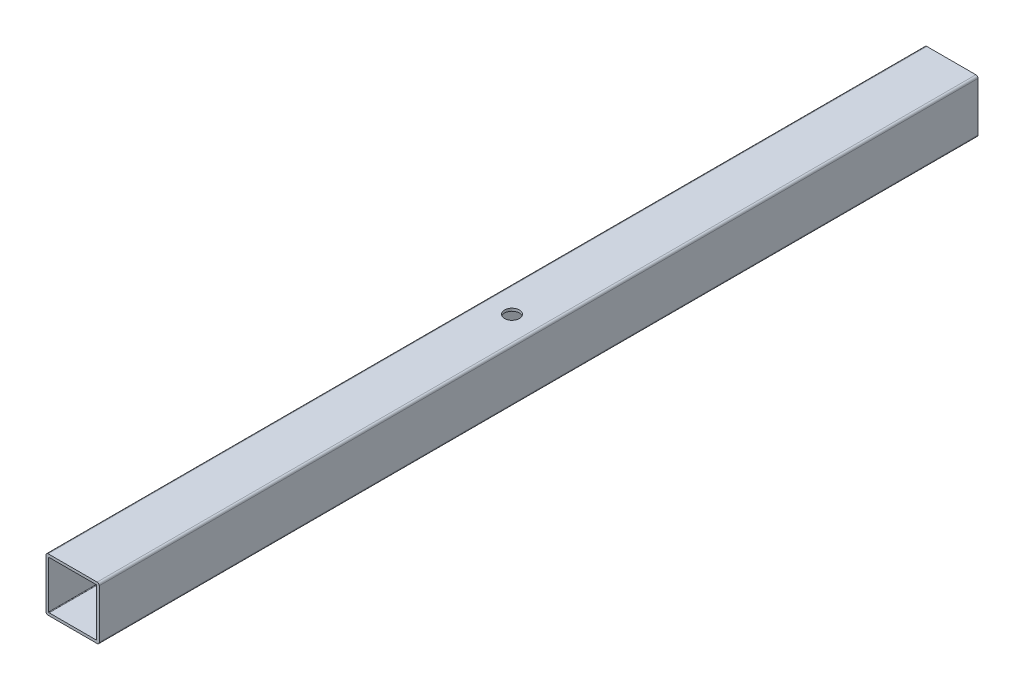
ISO-10303-21;
HEADER;
FILE_DESCRIPTION(('STEP AP214'),'2;1');
FILE_NAME('part.step','',(''),(''),'','','');
FILE_SCHEMA(('AUTOMOTIVE_DESIGN { 1 0 10303 214 1 1 1 1 }'));
ENDSEC;
DATA;
#1=APPLICATION_CONTEXT('core data for automotive mechanical design processes');
#2=APPLICATION_PROTOCOL_DEFINITION('international standard','automotive_design',2000,#1);
#3=PRODUCT_CONTEXT('',#1,'mechanical');
#4=PRODUCT('Part','Part','',(#3));
#5=PRODUCT_RELATED_PRODUCT_CATEGORY('part','',(#4));
#6=PRODUCT_DEFINITION_FORMATION('','',#4);
#7=PRODUCT_DEFINITION_CONTEXT('part definition',#1,'design');
#8=PRODUCT_DEFINITION('design','',#6,#7);
#9=PRODUCT_DEFINITION_SHAPE('','',#8);
#10=(LENGTH_UNIT() NAMED_UNIT(*) SI_UNIT(.MILLI.,.METRE.));
#11=(NAMED_UNIT(*) PLANE_ANGLE_UNIT() SI_UNIT($,.RADIAN.));
#12=(NAMED_UNIT(*) SI_UNIT($,.STERADIAN.) SOLID_ANGLE_UNIT());
#13=UNCERTAINTY_MEASURE_WITH_UNIT(LENGTH_MEASURE(1.E-05),#10,'distance_accuracy_value','');
#14=(GEOMETRIC_REPRESENTATION_CONTEXT(3) GLOBAL_UNCERTAINTY_ASSIGNED_CONTEXT((#13)) GLOBAL_UNIT_ASSIGNED_CONTEXT((#10,
#11,#12)) REPRESENTATION_CONTEXT('',''));
#15=CARTESIAN_POINT('',(0.,0.,0.));
#16=DIRECTION('',(0.,0.,1.));
#17=DIRECTION('',(1.,0.,0.));
#18=AXIS2_PLACEMENT_3D('',#15,#16,#17);
#19=CARTESIAN_POINT('',(1175.,100.,-825.));
#20=DIRECTION('',(-1.,0.,0.));
#21=DIRECTION('',(0.,0.,1.));
#22=AXIS2_PLACEMENT_3D('',#19,#20,#21);
#23=PLANE('',#22);
#24=DIRECTION('',(0.,1.,0.));
#25=VECTOR('',#24,1.);
#26=CARTESIAN_POINT('',(1175.,100.,825.));
#27=LINE('',#26,#25);
#28=CARTESIAN_POINT('',(1175.,96.,825.));
#29=VERTEX_POINT('',#28);
#30=CARTESIAN_POINT('',(1175.,4.,825.));
#31=VERTEX_POINT('',#30);
#32=EDGE_CURVE('E318',#29,#31,#27,.F.);
#33=ORIENTED_EDGE('',*,*,#32,.F.);
#34=DIRECTION('',(0.,0.,-1.));
#35=VECTOR('',#34,1.);
#36=CARTESIAN_POINT('',(1175.,96.,-825.));
#37=LINE('',#36,#35);
#38=CARTESIAN_POINT('',(1175.,96.,-825.));
#39=VERTEX_POINT('',#38);
#40=EDGE_CURVE('E174',#29,#39,#37,.T.);
#41=ORIENTED_EDGE('',*,*,#40,.T.);
#42=DIRECTION('',(0.,1.,0.));
#43=VECTOR('',#42,1.);
#44=CARTESIAN_POINT('',(1175.,100.,-825.));
#45=LINE('',#44,#43);
#46=CARTESIAN_POINT('',(1175.,4.,-825.));
#47=VERTEX_POINT('',#46);
#48=EDGE_CURVE('E156',#39,#47,#45,.F.);
#49=ORIENTED_EDGE('',*,*,#48,.T.);
#50=DIRECTION('',(0.,0.,-1.));
#51=VECTOR('',#50,1.);
#52=CARTESIAN_POINT('',(1175.,4.,-825.));
#53=LINE('',#52,#51);
#54=EDGE_CURVE('E177',#47,#31,#53,.F.);
#55=ORIENTED_EDGE('',*,*,#54,.T.);
#56=EDGE_LOOP('',(#33,#41,#49,#55));
#57=FACE_BOUND('',#56,.T.);
#58=ADVANCED_FACE('F19',(#57),#23,.T.);
#59=CARTESIAN_POINT('',(358.3,100.,925.));
#60=DIRECTION('',(0.,1.,0.));
#61=DIRECTION('',(0.,0.,1.));
#62=AXIS2_PLACEMENT_3D('',#59,#60,#61);
#63=PLANE('',#62);
#64=CARTESIAN_POINT('',(1225.,100.,0.));
#65=DIRECTION('',(0.,1.,0.));
#66=DIRECTION('',(0.,0.,1.));
#67=AXIS2_PLACEMENT_3D('',#64,#65,#66);
#68=CIRCLE('',#67,14.0000000000001);
#69=CARTESIAN_POINT('',(1225.,100.,14.0000000000001));
#70=VERTEX_POINT('',#69);
#71=EDGE_CURVE('E381',#70,#70,#68,.T.);
#72=ORIENTED_EDGE('',*,*,#71,.F.);
#73=EDGE_LOOP('',(#72));
#74=FACE_BOUND('',#73,.T.);
#75=DIRECTION('',(1.,0.,0.));
#76=VECTOR('',#75,1.);
#77=CARTESIAN_POINT('',(0.,100.,825.));
#78=LINE('',#77,#76);
#79=CARTESIAN_POINT('',(1271.,100.,825.));
#80=VERTEX_POINT('',#79);
#81=CARTESIAN_POINT('',(1179.,100.,825.));
#82=VERTEX_POINT('',#81);
#83=EDGE_CURVE('E297',#80,#82,#78,.F.);
#84=ORIENTED_EDGE('',*,*,#83,.F.);
#85=DIRECTION('',(0.,0.,1.));
#86=VECTOR('',#85,1.);
#87=CARTESIAN_POINT('',(1271.,100.,925.));
#88=LINE('',#87,#86);
#89=CARTESIAN_POINT('',(1271.,100.,-825.));
#90=VERTEX_POINT('',#89);
#91=EDGE_CURVE('E335',#80,#90,#88,.F.);
#92=ORIENTED_EDGE('',*,*,#91,.T.);
#93=DIRECTION('',(1.,0.,0.));
#94=VECTOR('',#93,1.);
#95=CARTESIAN_POINT('',(0.,100.,-825.));
#96=LINE('',#95,#94);
#97=CARTESIAN_POINT('',(1179.,100.,-825.));
#98=VERTEX_POINT('',#97);
#99=EDGE_CURVE('E155',#98,#90,#96,.T.);
#100=ORIENTED_EDGE('',*,*,#99,.F.);
#101=DIRECTION('',(0.,0.,-1.));
#102=VECTOR('',#101,1.);
#103=CARTESIAN_POINT('',(1179.,100.,925.));
#104=LINE('',#103,#102);
#105=EDGE_CURVE('E347',#98,#82,#104,.F.);
#106=ORIENTED_EDGE('',*,*,#105,.T.);
#107=EDGE_LOOP('',(#84,#92,#100,#106));
#108=FACE_BOUND('',#107,.T.);
#109=ADVANCED_FACE('F249',(#74,#108),#63,.T.);
#110=CARTESIAN_POINT('',(-1175.,100.,-825.));
#111=DIRECTION('',(0.,0.,1.));
#112=DIRECTION('',(1.,0.,0.));
#113=AXIS2_PLACEMENT_3D('',#110,#111,#112);
#114=PLANE('',#113);
#115=DIRECTION('',(0.,-1.,0.));
#116=VECTOR('',#115,1.);
#117=CARTESIAN_POINT('',(1180.,100.,-825.));
#118=LINE('',#117,#116);
#119=CARTESIAN_POINT('',(1180.,94.,-825.));
#120=VERTEX_POINT('',#119);
#121=CARTESIAN_POINT('',(1180.,6.00000000000001,-825.));
#122=VERTEX_POINT('',#121);
#123=EDGE_CURVE('E395',#120,#122,#118,.T.);
#124=ORIENTED_EDGE('',*,*,#123,.T.);
#125=CARTESIAN_POINT('',(1181.,6.,-825.));
#126=DIRECTION('',(0.,0.,1.));
#127=DIRECTION('',(1.,0.,0.));
#128=AXIS2_PLACEMENT_3D('',#125,#126,#127);
#129=CIRCLE('',#128,1.);
#130=CARTESIAN_POINT('',(1181.,5.,-825.));
#131=VERTEX_POINT('',#130);
#132=EDGE_CURVE('E215',#122,#131,#129,.T.);
#133=ORIENTED_EDGE('',*,*,#132,.T.);
#134=DIRECTION('',(1.,0.,0.));
#135=VECTOR('',#134,1.);
#136=CARTESIAN_POINT('',(-1175.,5.,-825.));
#137=LINE('',#136,#135);
#138=CARTESIAN_POINT('',(1269.,5.,-825.));
#139=VERTEX_POINT('',#138);
#140=EDGE_CURVE('E386',#131,#139,#137,.T.);
#141=ORIENTED_EDGE('',*,*,#140,.T.);
#142=CARTESIAN_POINT('',(1269.,6.,-825.));
#143=DIRECTION('',(0.,0.,1.));
#144=DIRECTION('',(1.,0.,0.));
#145=AXIS2_PLACEMENT_3D('',#142,#143,#144);
#146=CIRCLE('',#145,1.);
#147=CARTESIAN_POINT('',(1270.,6.00000000000001,-825.));
#148=VERTEX_POINT('',#147);
#149=EDGE_CURVE('E211',#139,#148,#146,.T.);
#150=ORIENTED_EDGE('',*,*,#149,.T.);
#151=DIRECTION('',(0.,1.,0.));
#152=VECTOR('',#151,1.);
#153=CARTESIAN_POINT('',(1270.,100.,-825.));
#154=LINE('',#153,#152);
#155=CARTESIAN_POINT('',(1270.,94.,-825.));
#156=VERTEX_POINT('',#155);
#157=EDGE_CURVE('E313',#148,#156,#154,.T.);
#158=ORIENTED_EDGE('',*,*,#157,.T.);
#159=CARTESIAN_POINT('',(1269.,94.,-825.));
#160=DIRECTION('',(0.,0.,1.));
#161=DIRECTION('',(1.,0.,0.));
#162=AXIS2_PLACEMENT_3D('',#159,#160,#161);
#163=CIRCLE('',#162,1.);
#164=CARTESIAN_POINT('',(1269.,95.,-825.));
#165=VERTEX_POINT('',#164);
#166=EDGE_CURVE('E29',#156,#165,#163,.T.);
#167=ORIENTED_EDGE('',*,*,#166,.T.);
#168=DIRECTION('',(-1.,0.,0.));
#169=VECTOR('',#168,1.);
#170=CARTESIAN_POINT('',(-1175.,95.0000000000004,-825.));
#171=LINE('',#170,#169);
#172=CARTESIAN_POINT('',(1181.,95.,-825.));
#173=VERTEX_POINT('',#172);
#174=EDGE_CURVE('E317',#165,#173,#171,.T.);
#175=ORIENTED_EDGE('',*,*,#174,.T.);
#176=CARTESIAN_POINT('',(1181.,94.,-825.));
#177=DIRECTION('',(0.,0.,1.));
#178=DIRECTION('',(1.,0.,0.));
#179=AXIS2_PLACEMENT_3D('',#176,#177,#178);
#180=CIRCLE('',#179,1.);
#181=EDGE_CURVE('E36',#173,#120,#180,.T.);
#182=ORIENTED_EDGE('',*,*,#181,.T.);
#183=EDGE_LOOP('',(#124,#133,#141,#150,#158,#167,#175,#182));
#184=FACE_BOUND('',#183,.T.);
#185=DIRECTION('',(-1.,0.,0.));
#186=VECTOR('',#185,1.);
#187=CARTESIAN_POINT('',(0.,0.,-825.));
#188=LINE('',#187,#186);
#189=CARTESIAN_POINT('',(1271.,0.,-825.));
#190=VERTEX_POINT('',#189);
#191=CARTESIAN_POINT('',(1179.,0.,-825.));
#192=VERTEX_POINT('',#191);
#193=EDGE_CURVE('E137',#190,#192,#188,.T.);
#194=ORIENTED_EDGE('',*,*,#193,.T.);
#195=CARTESIAN_POINT('',(1179.,4.,-825.));
#196=DIRECTION('',(0.,0.,1.));
#197=DIRECTION('',(1.,0.,0.));
#198=AXIS2_PLACEMENT_3D('',#195,#196,#197);
#199=CIRCLE('',#198,4.);
#200=EDGE_CURVE('E172',#192,#47,#199,.F.);
#201=ORIENTED_EDGE('',*,*,#200,.T.);
#202=ORIENTED_EDGE('',*,*,#48,.F.);
#203=CARTESIAN_POINT('',(1179.,96.,-825.));
#204=DIRECTION('',(0.,0.,1.));
#205=DIRECTION('',(1.,0.,0.));
#206=AXIS2_PLACEMENT_3D('',#203,#204,#205);
#207=CIRCLE('',#206,4.);
#208=EDGE_CURVE('E144',#39,#98,#207,.F.);
#209=ORIENTED_EDGE('',*,*,#208,.T.);
#210=ORIENTED_EDGE('',*,*,#99,.T.);
#211=CARTESIAN_POINT('',(1271.,96.,-825.));
#212=DIRECTION('',(0.,0.,1.));
#213=DIRECTION('',(1.,0.,0.));
#214=AXIS2_PLACEMENT_3D('',#211,#212,#213);
#215=CIRCLE('',#214,4.);
#216=CARTESIAN_POINT('',(1275.,96.,-825.));
#217=VERTEX_POINT('',#216);
#218=EDGE_CURVE('E145',#90,#217,#215,.F.);
#219=ORIENTED_EDGE('',*,*,#218,.T.);
#220=DIRECTION('',(0.,-1.,0.));
#221=VECTOR('',#220,1.);
#222=CARTESIAN_POINT('',(1275.,600.,-825.));
#223=LINE('',#222,#221);
#224=CARTESIAN_POINT('',(1275.,4.,-825.));
#225=VERTEX_POINT('',#224);
#226=EDGE_CURVE('E139',#217,#225,#223,.T.);
#227=ORIENTED_EDGE('',*,*,#226,.T.);
#228=CARTESIAN_POINT('',(1271.,4.,-825.));
#229=DIRECTION('',(0.,0.,1.));
#230=DIRECTION('',(1.,0.,0.));
#231=AXIS2_PLACEMENT_3D('',#228,#229,#230);
#232=CIRCLE('',#231,4.);
#233=EDGE_CURVE('E134',#225,#190,#232,.F.);
#234=ORIENTED_EDGE('',*,*,#233,.T.);
#235=EDGE_LOOP('',(#194,#201,#202,#209,#210,#219,#227,#234));
#236=FACE_BOUND('',#235,.T.);
#237=ADVANCED_FACE('F136',(#184,#236),#114,.F.);
#238=CARTESIAN_POINT('',(0.,0.,0.));
#239=DIRECTION('',(0.,-1.,0.));
#240=DIRECTION('',(0.,0.,-1.));
#241=AXIS2_PLACEMENT_3D('',#238,#239,#240);
#242=PLANE('',#241);
#243=CARTESIAN_POINT('',(1225.,0.,0.));
#244=DIRECTION('',(0.,-1.,0.));
#245=DIRECTION('',(0.,0.,-1.));
#246=AXIS2_PLACEMENT_3D('',#243,#244,#245);
#247=CIRCLE('',#246,14.0000000000001);
#248=CARTESIAN_POINT('',(1225.,0.,-14.0000000000001));
#249=VERTEX_POINT('',#248);
#250=EDGE_CURVE('E388',#249,#249,#247,.T.);
#251=ORIENTED_EDGE('',*,*,#250,.F.);
#252=EDGE_LOOP('',(#251));
#253=FACE_BOUND('',#252,.T.);
#254=DIRECTION('',(0.,0.,-1.));
#255=VECTOR('',#254,1.);
#256=CARTESIAN_POINT('',(1179.,0.,0.));
#257=LINE('',#256,#255);
#258=CARTESIAN_POINT('',(1179.,0.,825.));
#259=VERTEX_POINT('',#258);
#260=EDGE_CURVE('E153',#259,#192,#257,.T.);
#261=ORIENTED_EDGE('',*,*,#260,.T.);
#262=ORIENTED_EDGE('',*,*,#193,.F.);
#263=DIRECTION('',(0.,0.,-1.));
#264=VECTOR('',#263,1.);
#265=CARTESIAN_POINT('',(1271.,0.,0.));
#266=LINE('',#265,#264);
#267=CARTESIAN_POINT('',(1271.,0.,825.));
#268=VERTEX_POINT('',#267);
#269=EDGE_CURVE('E150',#190,#268,#266,.F.);
#270=ORIENTED_EDGE('',*,*,#269,.T.);
#271=DIRECTION('',(1.,0.,0.));
#272=VECTOR('',#271,1.);
#273=CARTESIAN_POINT('',(0.,0.,825.));
#274=LINE('',#273,#272);
#275=EDGE_CURVE('E321',#259,#268,#274,.T.);
#276=ORIENTED_EDGE('',*,*,#275,.F.);
#277=EDGE_LOOP('',(#261,#262,#270,#276));
#278=FACE_BOUND('',#277,.T.);
#279=ADVANCED_FACE('F148',(#253,#278),#242,.T.);
#280=CARTESIAN_POINT('',(-1275.,100.,825.));
#281=DIRECTION('',(0.,0.,-1.));
#282=DIRECTION('',(-1.,0.,0.));
#283=AXIS2_PLACEMENT_3D('',#280,#281,#282);
#284=PLANE('',#283);
#285=DIRECTION('',(0.,1.,0.));
#286=VECTOR('',#285,1.);
#287=CARTESIAN_POINT('',(1180.,100.,825.));
#288=LINE('',#287,#286);
#289=CARTESIAN_POINT('',(1180.,6.00000000000023,825.));
#290=VERTEX_POINT('',#289);
#291=CARTESIAN_POINT('',(1180.,94.0000000000002,825.));
#292=VERTEX_POINT('',#291);
#293=EDGE_CURVE('E231',#290,#292,#288,.T.);
#294=ORIENTED_EDGE('',*,*,#293,.T.);
#295=CARTESIAN_POINT('',(1181.,94.0000000000002,825.));
#296=DIRECTION('',(0.,0.,-1.));
#297=DIRECTION('',(-1.,0.,0.));
#298=AXIS2_PLACEMENT_3D('',#295,#296,#297);
#299=CIRCLE('',#298,1.);
#300=CARTESIAN_POINT('',(1181.,95.0000000000002,825.));
#301=VERTEX_POINT('',#300);
#302=EDGE_CURVE('E220',#292,#301,#299,.T.);
#303=ORIENTED_EDGE('',*,*,#302,.T.);
#304=DIRECTION('',(1.,0.,0.));
#305=VECTOR('',#304,1.);
#306=CARTESIAN_POINT('',(-1275.,95.0000000000006,825.));
#307=LINE('',#306,#305);
#308=CARTESIAN_POINT('',(1269.,95.0000000000002,825.));
#309=VERTEX_POINT('',#308);
#310=EDGE_CURVE('E164',#301,#309,#307,.T.);
#311=ORIENTED_EDGE('',*,*,#310,.T.);
#312=CARTESIAN_POINT('',(1269.,94.0000000000002,825.));
#313=DIRECTION('',(0.,0.,-1.));
#314=DIRECTION('',(-1.,0.,0.));
#315=AXIS2_PLACEMENT_3D('',#312,#313,#314);
#316=CIRCLE('',#315,1.);
#317=CARTESIAN_POINT('',(1270.,94.0000000000002,825.));
#318=VERTEX_POINT('',#317);
#319=EDGE_CURVE('E12',#309,#318,#316,.T.);
#320=ORIENTED_EDGE('',*,*,#319,.T.);
#321=DIRECTION('',(0.,-1.,0.));
#322=VECTOR('',#321,1.);
#323=CARTESIAN_POINT('',(1270.,100.,825.));
#324=LINE('',#323,#322);
#325=CARTESIAN_POINT('',(1270.,6.00000000000023,825.));
#326=VERTEX_POINT('',#325);
#327=EDGE_CURVE('E161',#318,#326,#324,.T.);
#328=ORIENTED_EDGE('',*,*,#327,.T.);
#329=CARTESIAN_POINT('',(1269.,6.00000000000023,825.));
#330=DIRECTION('',(0.,0.,-1.));
#331=DIRECTION('',(-1.,0.,0.));
#332=AXIS2_PLACEMENT_3D('',#329,#330,#331);
#333=CIRCLE('',#332,1.);
#334=CARTESIAN_POINT('',(1269.,5.00000000000023,825.));
#335=VERTEX_POINT('',#334);
#336=EDGE_CURVE('E213',#326,#335,#333,.T.);
#337=ORIENTED_EDGE('',*,*,#336,.T.);
#338=DIRECTION('',(-1.,0.,0.));
#339=VECTOR('',#338,1.);
#340=CARTESIAN_POINT('',(-1275.,5.00000000000023,825.));
#341=LINE('',#340,#339);
#342=CARTESIAN_POINT('',(1181.,5.00000000000023,825.));
#343=VERTEX_POINT('',#342);
#344=EDGE_CURVE('E290',#335,#343,#341,.T.);
#345=ORIENTED_EDGE('',*,*,#344,.T.);
#346=CARTESIAN_POINT('',(1181.,6.00000000000023,825.));
#347=DIRECTION('',(0.,0.,-1.));
#348=DIRECTION('',(-1.,0.,0.));
#349=AXIS2_PLACEMENT_3D('',#346,#347,#348);
#350=CIRCLE('',#349,1.);
#351=EDGE_CURVE('E217',#343,#290,#350,.T.);
#352=ORIENTED_EDGE('',*,*,#351,.T.);
#353=EDGE_LOOP('',(#294,#303,#311,#320,#328,#337,#345,#352));
#354=FACE_BOUND('',#353,.T.);
#355=ORIENTED_EDGE('',*,*,#32,.T.);
#356=CARTESIAN_POINT('',(1179.,4.,825.));
#357=DIRECTION('',(0.,0.,-1.));
#358=DIRECTION('',(-1.,0.,0.));
#359=AXIS2_PLACEMENT_3D('',#356,#357,#358);
#360=CIRCLE('',#359,4.);
#361=EDGE_CURVE('E339',#31,#259,#360,.F.);
#362=ORIENTED_EDGE('',*,*,#361,.T.);
#363=ORIENTED_EDGE('',*,*,#275,.T.);
#364=CARTESIAN_POINT('',(1271.,4.,825.));
#365=DIRECTION('',(0.,0.,-1.));
#366=DIRECTION('',(-1.,0.,0.));
#367=AXIS2_PLACEMENT_3D('',#364,#365,#366);
#368=CIRCLE('',#367,4.);
#369=CARTESIAN_POINT('',(1275.,4.,825.));
#370=VERTEX_POINT('',#369);
#371=EDGE_CURVE('E160',#268,#370,#368,.F.);
#372=ORIENTED_EDGE('',*,*,#371,.T.);
#373=DIRECTION('',(0.,1.,0.));
#374=VECTOR('',#373,1.);
#375=CARTESIAN_POINT('',(1275.,600.,825.));
#376=LINE('',#375,#374);
#377=CARTESIAN_POINT('',(1275.,96.,825.));
#378=VERTEX_POINT('',#377);
#379=EDGE_CURVE('E301',#370,#378,#376,.T.);
#380=ORIENTED_EDGE('',*,*,#379,.T.);
#381=CARTESIAN_POINT('',(1271.,96.,825.));
#382=DIRECTION('',(0.,0.,-1.));
#383=DIRECTION('',(-1.,0.,0.));
#384=AXIS2_PLACEMENT_3D('',#381,#382,#383);
#385=CIRCLE('',#384,4.);
#386=EDGE_CURVE('E337',#378,#80,#385,.F.);
#387=ORIENTED_EDGE('',*,*,#386,.T.);
#388=ORIENTED_EDGE('',*,*,#83,.T.);
#389=CARTESIAN_POINT('',(1179.,96.,825.));
#390=DIRECTION('',(0.,0.,-1.));
#391=DIRECTION('',(-1.,0.,0.));
#392=AXIS2_PLACEMENT_3D('',#389,#390,#391);
#393=CIRCLE('',#392,4.);
#394=EDGE_CURVE('E344',#82,#29,#393,.F.);
#395=ORIENTED_EDGE('',*,*,#394,.T.);
#396=EDGE_LOOP('',(#355,#362,#363,#372,#380,#387,#388,#395));
#397=FACE_BOUND('',#396,.T.);
#398=ADVANCED_FACE('F227',(#354,#397),#284,.F.);
#399=CARTESIAN_POINT('',(1275.,600.,915.));
#400=DIRECTION('',(1.,0.,0.));
#401=DIRECTION('',(0.,0.,-1.));
#402=AXIS2_PLACEMENT_3D('',#399,#400,#401);
#403=PLANE('',#402);
#404=ORIENTED_EDGE('',*,*,#379,.F.);
#405=DIRECTION('',(0.,0.,-1.));
#406=VECTOR('',#405,1.);
#407=CARTESIAN_POINT('',(1275.,4.,915.));
#408=LINE('',#407,#406);
#409=EDGE_CURVE('E186',#370,#225,#408,.T.);
#410=ORIENTED_EDGE('',*,*,#409,.T.);
#411=ORIENTED_EDGE('',*,*,#226,.F.);
#412=DIRECTION('',(0.,0.,1.));
#413=VECTOR('',#412,1.);
#414=CARTESIAN_POINT('',(1275.,96.,915.));
#415=LINE('',#414,#413);
#416=EDGE_CURVE('E190',#217,#378,#415,.T.);
#417=ORIENTED_EDGE('',*,*,#416,.T.);
#418=EDGE_LOOP('',(#404,#410,#411,#417));
#419=FACE_BOUND('',#418,.T.);
#420=ADVANCED_FACE('F257',(#419),#403,.T.);
#421=CARTESIAN_POINT('',(1270.,95.0000000000002,925.));
#422=DIRECTION('',(1.,0.,0.));
#423=DIRECTION('',(0.,0.,-1.));
#424=AXIS2_PLACEMENT_3D('',#421,#422,#423);
#425=PLANE('',#424);
#426=ORIENTED_EDGE('',*,*,#157,.F.);
#427=DIRECTION('',(0.,0.,-1.));
#428=VECTOR('',#427,1.);
#429=CARTESIAN_POINT('',(1270.,6.00000000000023,825.));
#430=LINE('',#429,#428);
#431=EDGE_CURVE('E200',#148,#326,#430,.F.);
#432=ORIENTED_EDGE('',*,*,#431,.T.);
#433=ORIENTED_EDGE('',*,*,#327,.F.);
#434=DIRECTION('',(0.,0.,-1.));
#435=VECTOR('',#434,1.);
#436=CARTESIAN_POINT('',(1270.,94.,-825.));
#437=LINE('',#436,#435);
#438=EDGE_CURVE('E197',#318,#156,#437,.T.);
#439=ORIENTED_EDGE('',*,*,#438,.T.);
#440=EDGE_LOOP('',(#426,#432,#433,#439));
#441=FACE_BOUND('',#440,.T.);
#442=ADVANCED_FACE('F264',(#441),#425,.F.);
#443=CARTESIAN_POINT('',(1180.,95.0000000000002,925.));
#444=DIRECTION('',(0.,1.,0.));
#445=DIRECTION('',(-1.,0.,0.));
#446=AXIS2_PLACEMENT_3D('',#443,#444,#445);
#447=PLANE('',#446);
#448=CARTESIAN_POINT('',(1225.,95.0000000000001,0.));
#449=DIRECTION('',(0.,1.,0.));
#450=DIRECTION('',(-1.,0.,0.));
#451=AXIS2_PLACEMENT_3D('',#448,#449,#450);
#452=CIRCLE('',#451,14.0000000000001);
#453=CARTESIAN_POINT('',(1211.,95.0000000000001,0.));
#454=VERTEX_POINT('',#453);
#455=EDGE_CURVE('E384',#454,#454,#452,.T.);
#456=ORIENTED_EDGE('',*,*,#455,.T.);
#457=EDGE_LOOP('',(#456));
#458=FACE_BOUND('',#457,.T.);
#459=ORIENTED_EDGE('',*,*,#310,.F.);
#460=DIRECTION('',(0.,0.,-1.));
#461=VECTOR('',#460,1.);
#462=CARTESIAN_POINT('',(1181.,95.,-825.));
#463=LINE('',#462,#461);
#464=EDGE_CURVE('E209',#301,#173,#463,.T.);
#465=ORIENTED_EDGE('',*,*,#464,.T.);
#466=ORIENTED_EDGE('',*,*,#174,.F.);
#467=DIRECTION('',(0.,0.,-1.));
#468=VECTOR('',#467,1.);
#469=CARTESIAN_POINT('',(1269.,95.0000000000002,825.));
#470=LINE('',#469,#468);
#471=EDGE_CURVE('E207',#165,#309,#470,.F.);
#472=ORIENTED_EDGE('',*,*,#471,.T.);
#473=EDGE_LOOP('',(#459,#465,#466,#472));
#474=FACE_BOUND('',#473,.T.);
#475=ADVANCED_FACE('F233',(#458,#474),#447,.F.);
#476=CARTESIAN_POINT('',(1180.,5.00000000000024,925.));
#477=DIRECTION('',(-1.,0.,0.));
#478=DIRECTION('',(0.,0.,1.));
#479=AXIS2_PLACEMENT_3D('',#476,#477,#478);
#480=PLANE('',#479);
#481=ORIENTED_EDGE('',*,*,#293,.F.);
#482=DIRECTION('',(0.,0.,-1.));
#483=VECTOR('',#482,1.);
#484=CARTESIAN_POINT('',(1180.,6.,-825.));
#485=LINE('',#484,#483);
#486=EDGE_CURVE('E204',#290,#122,#485,.T.);
#487=ORIENTED_EDGE('',*,*,#486,.T.);
#488=ORIENTED_EDGE('',*,*,#123,.F.);
#489=DIRECTION('',(0.,0.,-1.));
#490=VECTOR('',#489,1.);
#491=CARTESIAN_POINT('',(1180.,94.0000000000002,825.));
#492=LINE('',#491,#490);
#493=EDGE_CURVE('E202',#120,#292,#492,.F.);
#494=ORIENTED_EDGE('',*,*,#493,.T.);
#495=EDGE_LOOP('',(#481,#487,#488,#494));
#496=FACE_BOUND('',#495,.T.);
#497=ADVANCED_FACE('F363',(#496),#480,.F.);
#498=CARTESIAN_POINT('',(1270.,5.00000000000024,925.));
#499=DIRECTION('',(0.,-1.,0.));
#500=DIRECTION('',(0.,0.,-1.));
#501=AXIS2_PLACEMENT_3D('',#498,#499,#500);
#502=PLANE('',#501);
#503=CARTESIAN_POINT('',(1225.,5.00000000000012,0.));
#504=DIRECTION('',(0.,-1.,0.));
#505=DIRECTION('',(0.,0.,-1.));
#506=AXIS2_PLACEMENT_3D('',#503,#504,#505);
#507=CIRCLE('',#506,14.0000000000001);
#508=CARTESIAN_POINT('',(1225.,5.00000000000011,-14.0000000000001));
#509=VERTEX_POINT('',#508);
#510=EDGE_CURVE('E23',#509,#509,#507,.T.);
#511=ORIENTED_EDGE('',*,*,#510,.T.);
#512=EDGE_LOOP('',(#511));
#513=FACE_BOUND('',#512,.T.);
#514=ORIENTED_EDGE('',*,*,#344,.F.);
#515=DIRECTION('',(0.,0.,-1.));
#516=VECTOR('',#515,1.);
#517=CARTESIAN_POINT('',(1269.,5.,-825.));
#518=LINE('',#517,#516);
#519=EDGE_CURVE('E194',#335,#139,#518,.T.);
#520=ORIENTED_EDGE('',*,*,#519,.T.);
#521=ORIENTED_EDGE('',*,*,#140,.F.);
#522=DIRECTION('',(0.,0.,-1.));
#523=VECTOR('',#522,1.);
#524=CARTESIAN_POINT('',(1181.,5.00000000000023,825.));
#525=LINE('',#524,#523);
#526=EDGE_CURVE('E189',#131,#343,#525,.F.);
#527=ORIENTED_EDGE('',*,*,#526,.T.);
#528=EDGE_LOOP('',(#514,#520,#521,#527));
#529=FACE_BOUND('',#528,.T.);
#530=ADVANCED_FACE('F270',(#513,#529),#502,.F.);
#531=CARTESIAN_POINT('',(1179.,4.,0.));
#532=DIRECTION('',(0.,0.,-1.));
#533=DIRECTION('',(-1.,0.,0.));
#534=AXIS2_PLACEMENT_3D('',#531,#532,#533);
#535=CYLINDRICAL_SURFACE('',#534,4.);
#536=ORIENTED_EDGE('',*,*,#361,.F.);
#537=ORIENTED_EDGE('',*,*,#54,.F.);
#538=ORIENTED_EDGE('',*,*,#200,.F.);
#539=ORIENTED_EDGE('',*,*,#260,.F.);
#540=EDGE_LOOP('',(#536,#537,#538,#539));
#541=FACE_BOUND('',#540,.T.);
#542=ADVANCED_FACE('F266',(#541),#535,.T.);
#543=CARTESIAN_POINT('',(1179.,96.,-825.));
#544=DIRECTION('',(0.,0.,-1.));
#545=DIRECTION('',(-1.,0.,0.));
#546=AXIS2_PLACEMENT_3D('',#543,#544,#545);
#547=CYLINDRICAL_SURFACE('',#546,4.);
#548=ORIENTED_EDGE('',*,*,#394,.F.);
#549=ORIENTED_EDGE('',*,*,#105,.F.);
#550=ORIENTED_EDGE('',*,*,#208,.F.);
#551=ORIENTED_EDGE('',*,*,#40,.F.);
#552=EDGE_LOOP('',(#548,#549,#550,#551));
#553=FACE_BOUND('',#552,.T.);
#554=ADVANCED_FACE('F269',(#553),#547,.T.);
#555=CARTESIAN_POINT('',(1271.,4.,915.));
#556=DIRECTION('',(0.,0.,-1.));
#557=DIRECTION('',(-1.,0.,0.));
#558=AXIS2_PLACEMENT_3D('',#555,#556,#557);
#559=CYLINDRICAL_SURFACE('',#558,4.);
#560=ORIENTED_EDGE('',*,*,#371,.F.);
#561=ORIENTED_EDGE('',*,*,#269,.F.);
#562=ORIENTED_EDGE('',*,*,#233,.F.);
#563=ORIENTED_EDGE('',*,*,#409,.F.);
#564=EDGE_LOOP('',(#560,#561,#562,#563));
#565=FACE_BOUND('',#564,.T.);
#566=ADVANCED_FACE('F159',(#565),#559,.T.);
#567=CARTESIAN_POINT('',(1271.,96.,915.));
#568=DIRECTION('',(0.,0.,1.));
#569=DIRECTION('',(1.,0.,0.));
#570=AXIS2_PLACEMENT_3D('',#567,#568,#569);
#571=CYLINDRICAL_SURFACE('',#570,4.);
#572=ORIENTED_EDGE('',*,*,#218,.F.);
#573=ORIENTED_EDGE('',*,*,#91,.F.);
#574=ORIENTED_EDGE('',*,*,#386,.F.);
#575=ORIENTED_EDGE('',*,*,#416,.F.);
#576=EDGE_LOOP('',(#572,#573,#574,#575));
#577=FACE_BOUND('',#576,.T.);
#578=ADVANCED_FACE('F277',(#577),#571,.T.);
#579=CARTESIAN_POINT('',(1269.,6.00000000000024,925.));
#580=DIRECTION('',(0.,0.,1.));
#581=DIRECTION('',(0.,-1.,0.));
#582=AXIS2_PLACEMENT_3D('',#579,#580,#581);
#583=CYLINDRICAL_SURFACE('',#582,1.);
#584=ORIENTED_EDGE('',*,*,#336,.F.);
#585=ORIENTED_EDGE('',*,*,#431,.F.);
#586=ORIENTED_EDGE('',*,*,#149,.F.);
#587=ORIENTED_EDGE('',*,*,#519,.F.);
#588=EDGE_LOOP('',(#584,#585,#586,#587));
#589=FACE_BOUND('',#588,.T.);
#590=ADVANCED_FACE('F245',(#589),#583,.F.);
#591=CARTESIAN_POINT('',(1181.,6.00000000000024,925.));
#592=DIRECTION('',(0.,0.,1.));
#593=DIRECTION('',(0.,-1.,0.));
#594=AXIS2_PLACEMENT_3D('',#591,#592,#593);
#595=CYLINDRICAL_SURFACE('',#594,1.);
#596=ORIENTED_EDGE('',*,*,#351,.F.);
#597=ORIENTED_EDGE('',*,*,#526,.F.);
#598=ORIENTED_EDGE('',*,*,#132,.F.);
#599=ORIENTED_EDGE('',*,*,#486,.F.);
#600=EDGE_LOOP('',(#596,#597,#598,#599));
#601=FACE_BOUND('',#600,.T.);
#602=ADVANCED_FACE('F237',(#601),#595,.F.);
#603=CARTESIAN_POINT('',(1181.,94.0000000000002,925.));
#604=DIRECTION('',(0.,0.,1.));
#605=DIRECTION('',(0.,-1.,0.));
#606=AXIS2_PLACEMENT_3D('',#603,#604,#605);
#607=CYLINDRICAL_SURFACE('',#606,1.);
#608=ORIENTED_EDGE('',*,*,#302,.F.);
#609=ORIENTED_EDGE('',*,*,#493,.F.);
#610=ORIENTED_EDGE('',*,*,#181,.F.);
#611=ORIENTED_EDGE('',*,*,#464,.F.);
#612=EDGE_LOOP('',(#608,#609,#610,#611));
#613=FACE_BOUND('',#612,.T.);
#614=ADVANCED_FACE('F235',(#613),#607,.F.);
#615=CARTESIAN_POINT('',(1269.,94.0000000000002,925.));
#616=DIRECTION('',(0.,0.,1.));
#617=DIRECTION('',(0.,-1.,0.));
#618=AXIS2_PLACEMENT_3D('',#615,#616,#617);
#619=CYLINDRICAL_SURFACE('',#618,1.);
#620=ORIENTED_EDGE('',*,*,#319,.F.);
#621=ORIENTED_EDGE('',*,*,#471,.F.);
#622=ORIENTED_EDGE('',*,*,#166,.F.);
#623=ORIENTED_EDGE('',*,*,#438,.F.);
#624=EDGE_LOOP('',(#620,#621,#622,#623));
#625=FACE_BOUND('',#624,.T.);
#626=ADVANCED_FACE('F21',(#625),#619,.F.);
#627=CARTESIAN_POINT('',(1225.,130.,0.));
#628=DIRECTION('',(0.,-1.,0.));
#629=DIRECTION('',(0.,0.,-1.));
#630=AXIS2_PLACEMENT_3D('',#627,#628,#629);
#631=CYLINDRICAL_SURFACE('',#630,14.0000000000001);
#632=ORIENTED_EDGE('',*,*,#250,.T.);
#633=EDGE_LOOP('',(#632));
#634=FACE_BOUND('',#633,.T.);
#635=ORIENTED_EDGE('',*,*,#510,.F.);
#636=EDGE_LOOP('',(#635));
#637=FACE_BOUND('',#636,.T.);
#638=ADVANCED_FACE('F243',(#634,#637),#631,.F.);
#639=ORIENTED_EDGE('',*,*,#71,.T.);
#640=EDGE_LOOP('',(#639));
#641=FACE_BOUND('',#640,.T.);
#642=ORIENTED_EDGE('',*,*,#455,.F.);
#643=EDGE_LOOP('',(#642));
#644=FACE_BOUND('',#643,.T.);
#645=ADVANCED_FACE('F371',(#641,#644),#631,.F.);
#646=CLOSED_SHELL('',(#58,#109,#237,#279,#398,#420,#442,#475,#497,#530,#542,#554,#566,#578,#590,
#602,#614,#626,#638,#645));
#647=MANIFOLD_SOLID_BREP('B1',#646);
#648=ADVANCED_BREP_SHAPE_REPRESENTATION('',(#18,#647),#14);
#649=SHAPE_DEFINITION_REPRESENTATION(#9,#648);
ENDSEC;
END-ISO-10303-21;
